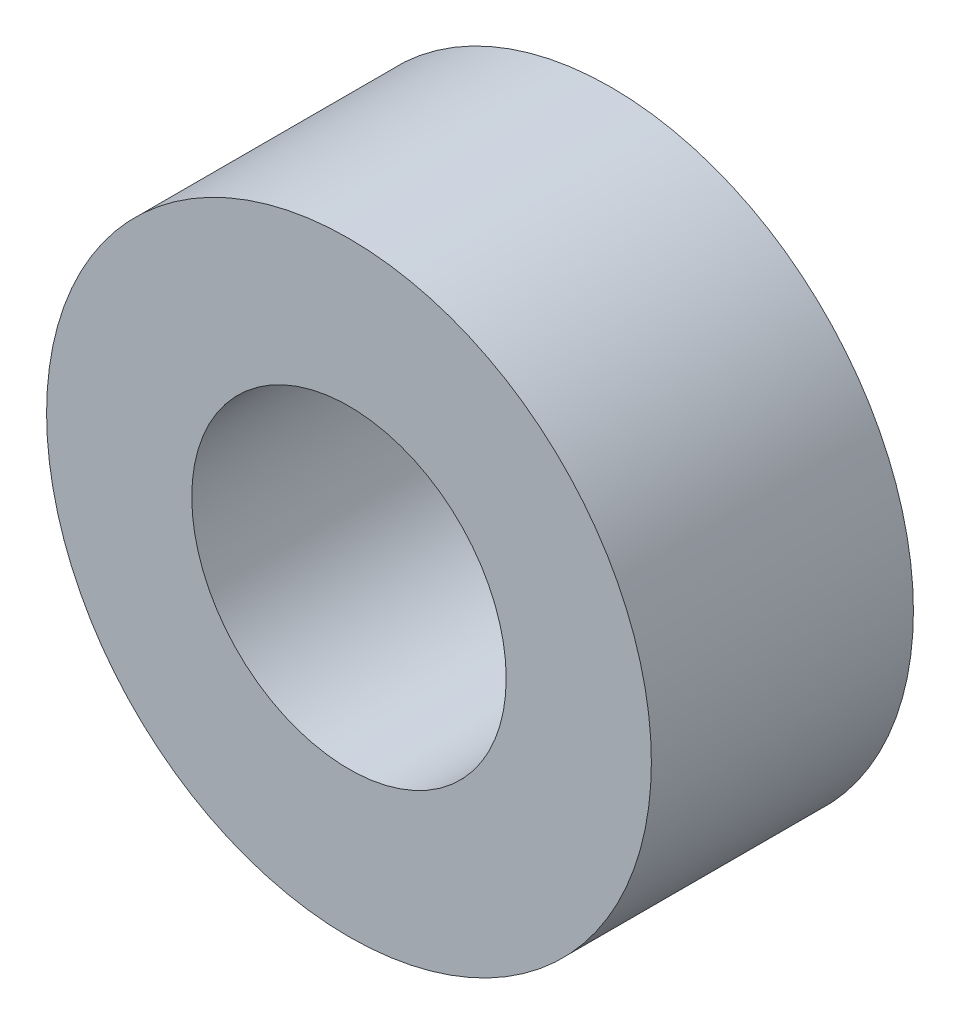
ISO-10303-21;
HEADER;
FILE_DESCRIPTION(('STEP AP214'),'2;1');
FILE_NAME('part.step','',(''),(''),'','','');
FILE_SCHEMA(('AUTOMOTIVE_DESIGN { 1 0 10303 214 1 1 1 1 }'));
ENDSEC;
DATA;
#1=APPLICATION_CONTEXT('core data for automotive mechanical design processes');
#2=APPLICATION_PROTOCOL_DEFINITION('international standard','automotive_design',2000,#1);
#3=PRODUCT_CONTEXT('',#1,'mechanical');
#4=PRODUCT('Part','Part','',(#3));
#5=PRODUCT_RELATED_PRODUCT_CATEGORY('part','',(#4));
#6=PRODUCT_DEFINITION_FORMATION('','',#4);
#7=PRODUCT_DEFINITION_CONTEXT('part definition',#1,'design');
#8=PRODUCT_DEFINITION('design','',#6,#7);
#9=PRODUCT_DEFINITION_SHAPE('','',#8);
#10=(LENGTH_UNIT() NAMED_UNIT(*) SI_UNIT(.MILLI.,.METRE.));
#11=(NAMED_UNIT(*) PLANE_ANGLE_UNIT() SI_UNIT($,.RADIAN.));
#12=(NAMED_UNIT(*) SI_UNIT($,.STERADIAN.) SOLID_ANGLE_UNIT());
#13=UNCERTAINTY_MEASURE_WITH_UNIT(LENGTH_MEASURE(1.E-05),#10,'distance_accuracy_value','');
#14=(GEOMETRIC_REPRESENTATION_CONTEXT(3) GLOBAL_UNCERTAINTY_ASSIGNED_CONTEXT((#13)) GLOBAL_UNIT_ASSIGNED_CONTEXT((#10,
#11,#12)) REPRESENTATION_CONTEXT('',''));
#15=CARTESIAN_POINT('',(0.,0.,0.));
#16=DIRECTION('',(0.,0.,1.));
#17=DIRECTION('',(1.,0.,0.));
#18=AXIS2_PLACEMENT_3D('',#15,#16,#17);
#19=CARTESIAN_POINT('',(0.,0.,5.));
#20=DIRECTION('',(0.,0.,-1.));
#21=DIRECTION('',(-1.,0.,0.));
#22=AXIS2_PLACEMENT_3D('',#19,#20,#21);
#23=CYLINDRICAL_SURFACE('',#22,5.77);
#24=CARTESIAN_POINT('',(0.,0.,5.));
#25=DIRECTION('',(0.,0.,1.));
#26=DIRECTION('',(1.,0.,0.));
#27=AXIS2_PLACEMENT_3D('',#24,#25,#26);
#28=CIRCLE('',#27,5.77);
#29=CARTESIAN_POINT('',(5.77,0.,5.));
#30=VERTEX_POINT('',#29);
#31=EDGE_CURVE('E10',#30,#30,#28,.T.);
#32=ORIENTED_EDGE('',*,*,#31,.F.);
#33=EDGE_LOOP('',(#32));
#34=FACE_BOUND('',#33,.T.);
#35=CARTESIAN_POINT('',(0.,0.,0.));
#36=DIRECTION('',(0.,0.,1.));
#37=DIRECTION('',(1.,0.,0.));
#38=AXIS2_PLACEMENT_3D('',#35,#36,#37);
#39=CIRCLE('',#38,5.77);
#40=CARTESIAN_POINT('',(5.77,0.,0.));
#41=VERTEX_POINT('',#40);
#42=EDGE_CURVE('E48',#41,#41,#39,.T.);
#43=ORIENTED_EDGE('',*,*,#42,.T.);
#44=EDGE_LOOP('',(#43));
#45=FACE_BOUND('',#44,.T.);
#46=ADVANCED_FACE('F45',(#34,#45),#23,.T.);
#47=CARTESIAN_POINT('',(0.,0.,5.));
#48=DIRECTION('',(0.,0.,1.));
#49=DIRECTION('',(1.,0.,0.));
#50=AXIS2_PLACEMENT_3D('',#47,#48,#49);
#51=PLANE('',#50);
#52=CARTESIAN_POINT('',(0.,0.,5.));
#53=DIRECTION('',(0.,0.,1.));
#54=DIRECTION('',(1.,0.,0.));
#55=AXIS2_PLACEMENT_3D('',#52,#53,#54);
#56=CIRCLE('',#55,3.);
#57=CARTESIAN_POINT('',(3.,0.,5.));
#58=VERTEX_POINT('',#57);
#59=EDGE_CURVE('E58',#58,#58,#56,.T.);
#60=ORIENTED_EDGE('',*,*,#59,.F.);
#61=EDGE_LOOP('',(#60));
#62=FACE_BOUND('',#61,.T.);
#63=ORIENTED_EDGE('',*,*,#31,.T.);
#64=EDGE_LOOP('',(#63));
#65=FACE_BOUND('',#64,.T.);
#66=ADVANCED_FACE('F72',(#62,#65),#51,.T.);
#67=CARTESIAN_POINT('',(0.,0.,0.));
#68=DIRECTION('',(0.,0.,1.));
#69=DIRECTION('',(1.,0.,0.));
#70=AXIS2_PLACEMENT_3D('',#67,#68,#69);
#71=PLANE('',#70);
#72=CARTESIAN_POINT('',(0.,0.,0.));
#73=DIRECTION('',(0.,0.,-1.));
#74=DIRECTION('',(-1.,0.,0.));
#75=AXIS2_PLACEMENT_3D('',#72,#73,#74);
#76=CIRCLE('',#75,3.);
#77=CARTESIAN_POINT('',(-3.,0.,0.));
#78=VERTEX_POINT('',#77);
#79=EDGE_CURVE('E63',#78,#78,#76,.T.);
#80=ORIENTED_EDGE('',*,*,#79,.F.);
#81=EDGE_LOOP('',(#80));
#82=FACE_BOUND('',#81,.T.);
#83=ORIENTED_EDGE('',*,*,#42,.F.);
#84=EDGE_LOOP('',(#83));
#85=FACE_BOUND('',#84,.T.);
#86=ADVANCED_FACE('F69',(#82,#85),#71,.F.);
#87=CARTESIAN_POINT('',(0.,0.,6.));
#88=DIRECTION('',(0.,0.,-1.));
#89=DIRECTION('',(-1.,0.,0.));
#90=AXIS2_PLACEMENT_3D('',#87,#88,#89);
#91=CYLINDRICAL_SURFACE('',#90,3.);
#92=ORIENTED_EDGE('',*,*,#59,.T.);
#93=EDGE_LOOP('',(#92));
#94=FACE_BOUND('',#93,.T.);
#95=ORIENTED_EDGE('',*,*,#79,.T.);
#96=EDGE_LOOP('',(#95));
#97=FACE_BOUND('',#96,.T.);
#98=ADVANCED_FACE('F67',(#94,#97),#91,.F.);
#99=CLOSED_SHELL('',(#46,#66,#86,#98));
#100=MANIFOLD_SOLID_BREP('B2',#99);
#101=ADVANCED_BREP_SHAPE_REPRESENTATION('',(#18,#100),#14);
#102=SHAPE_DEFINITION_REPRESENTATION(#9,#101);
ENDSEC;
END-ISO-10303-21;
